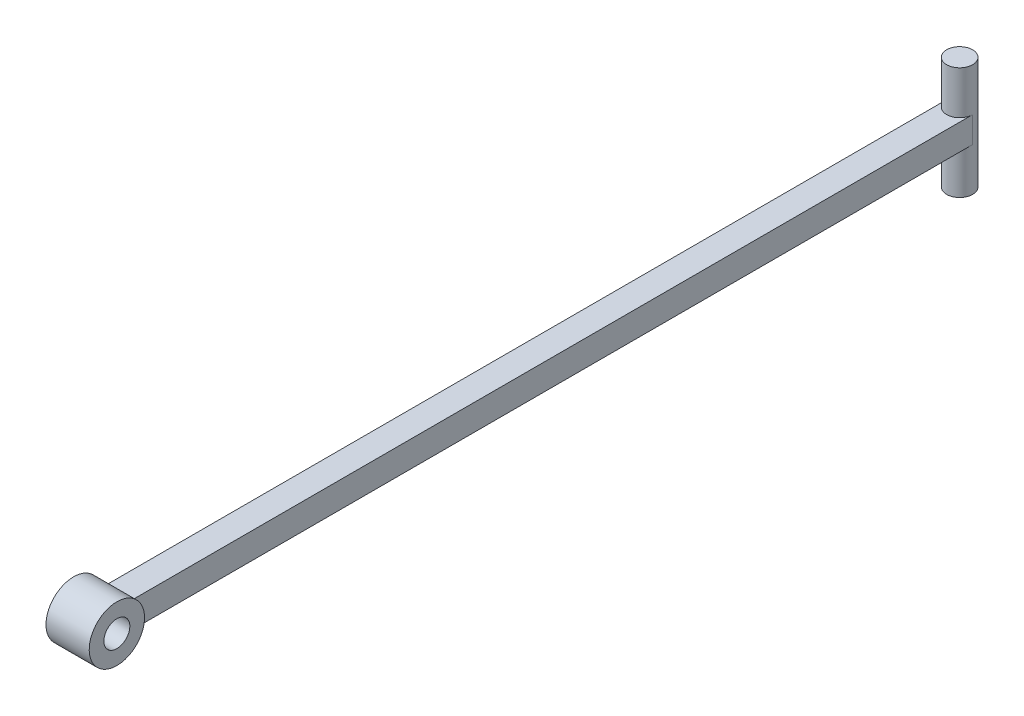
ISO-10303-21;
HEADER;
FILE_DESCRIPTION(('STEP AP214'),'2;1');
FILE_NAME('part.step','',(''),(''),'','','');
FILE_SCHEMA(('AUTOMOTIVE_DESIGN { 1 0 10303 214 1 1 1 1 }'));
ENDSEC;
DATA;
#1=APPLICATION_CONTEXT('core data for automotive mechanical design processes');
#2=APPLICATION_PROTOCOL_DEFINITION('international standard','automotive_design',2000,#1);
#3=PRODUCT_CONTEXT('',#1,'mechanical');
#4=PRODUCT('Part','Part','',(#3));
#5=PRODUCT_RELATED_PRODUCT_CATEGORY('part','',(#4));
#6=PRODUCT_DEFINITION_FORMATION('','',#4);
#7=PRODUCT_DEFINITION_CONTEXT('part definition',#1,'design');
#8=PRODUCT_DEFINITION('design','',#6,#7);
#9=PRODUCT_DEFINITION_SHAPE('','',#8);
#10=(LENGTH_UNIT() NAMED_UNIT(*) SI_UNIT(.MILLI.,.METRE.));
#11=(NAMED_UNIT(*) PLANE_ANGLE_UNIT() SI_UNIT($,.RADIAN.));
#12=(NAMED_UNIT(*) SI_UNIT($,.STERADIAN.) SOLID_ANGLE_UNIT());
#13=UNCERTAINTY_MEASURE_WITH_UNIT(LENGTH_MEASURE(1.E-05),#10,'distance_accuracy_value','');
#14=(GEOMETRIC_REPRESENTATION_CONTEXT(3) GLOBAL_UNCERTAINTY_ASSIGNED_CONTEXT((#13)) GLOBAL_UNIT_ASSIGNED_CONTEXT((#10,
#11,#12)) REPRESENTATION_CONTEXT('',''));
#15=CARTESIAN_POINT('',(0.,0.,0.));
#16=DIRECTION('',(0.,0.,1.));
#17=DIRECTION('',(1.,0.,0.));
#18=AXIS2_PLACEMENT_3D('',#15,#16,#17);
#19=CARTESIAN_POINT('',(0.,0.,2000.));
#20=DIRECTION('',(1.,0.,0.));
#21=DIRECTION('',(0.,1.,0.));
#22=AXIS2_PLACEMENT_3D('',#19,#20,#21);
#23=PLANE('',#22);
#24=DIRECTION('',(0.,0.,-1.));
#25=VECTOR('',#24,1.);
#26=CARTESIAN_POINT('',(0.,-60.,2000.));
#27=LINE('',#26,#25);
#28=CARTESIAN_POINT('',(0.,-60.,1943.46682389959));
#29=VERTEX_POINT('',#28);
#30=CARTESIAN_POINT('',(0.,-60.,0.));
#31=VERTEX_POINT('',#30);
#32=EDGE_CURVE('E47',#29,#31,#27,.T.);
#33=ORIENTED_EDGE('',*,*,#32,.F.);
#34=CARTESIAN_POINT('',(0.,-30.,2000.));
#35=DIRECTION('',(1.,0.,0.));
#36=DIRECTION('',(0.,1.,0.));
#37=AXIS2_PLACEMENT_3D('',#34,#35,#36);
#38=CIRCLE('',#37,64.0000000000001);
#39=CARTESIAN_POINT('',(0.,0.,1943.46682389959));
#40=VERTEX_POINT('',#39);
#41=EDGE_CURVE('E79',#29,#40,#38,.T.);
#42=ORIENTED_EDGE('',*,*,#41,.T.);
#43=DIRECTION('',(0.,0.,-1.));
#44=VECTOR('',#43,1.);
#45=CARTESIAN_POINT('',(0.,0.,2000.));
#46=LINE('',#45,#44);
#47=CARTESIAN_POINT('',(0.,0.,0.));
#48=VERTEX_POINT('',#47);
#49=EDGE_CURVE('E85',#40,#48,#46,.T.);
#50=ORIENTED_EDGE('',*,*,#49,.T.);
#51=DIRECTION('',(0.,-1.,0.));
#52=VECTOR('',#51,1.);
#53=CARTESIAN_POINT('',(0.,0.,0.));
#54=LINE('',#53,#52);
#55=EDGE_CURVE('E104',#48,#31,#54,.T.);
#56=ORIENTED_EDGE('',*,*,#55,.T.);
#57=EDGE_LOOP('',(#33,#42,#50,#56));
#58=FACE_BOUND('',#57,.T.);
#59=ADVANCED_FACE('F39',(#58),#23,.F.);
#60=CARTESIAN_POINT('',(0.,-60.,2000.));
#61=DIRECTION('',(0.,1.,0.));
#62=DIRECTION('',(0.,0.,1.));
#63=AXIS2_PLACEMENT_3D('',#60,#61,#62);
#64=PLANE('',#63);
#65=DIRECTION('',(0.,0.,-1.));
#66=VECTOR('',#65,1.);
#67=CARTESIAN_POINT('',(60.,-60.,2000.));
#68=LINE('',#67,#66);
#69=CARTESIAN_POINT('',(60.,-60.,1943.46682389959));
#70=VERTEX_POINT('',#69);
#71=CARTESIAN_POINT('',(60.,-60.,0.));
#72=VERTEX_POINT('',#71);
#73=EDGE_CURVE('E101',#70,#72,#68,.T.);
#74=ORIENTED_EDGE('',*,*,#73,.F.);
#75=DIRECTION('',(1.,0.,0.));
#76=VECTOR('',#75,1.);
#77=CARTESIAN_POINT('',(-20.,-60.,1943.46682389959));
#78=LINE('',#77,#76);
#79=EDGE_CURVE('E89',#70,#29,#78,.F.);
#80=ORIENTED_EDGE('',*,*,#79,.T.);
#81=ORIENTED_EDGE('',*,*,#32,.T.);
#82=CARTESIAN_POINT('',(30.,-60.,0.));
#83=DIRECTION('',(0.,1.,0.));
#84=DIRECTION('',(0.,0.,1.));
#85=AXIS2_PLACEMENT_3D('',#82,#83,#84);
#86=CIRCLE('',#85,30.);
#87=EDGE_CURVE('E116',#31,#72,#86,.T.);
#88=ORIENTED_EDGE('',*,*,#87,.T.);
#89=EDGE_LOOP('',(#74,#80,#81,#88));
#90=FACE_BOUND('',#89,.T.);
#91=ADVANCED_FACE('F117',(#90),#64,.F.);
#92=CARTESIAN_POINT('',(60.,0.,2000.));
#93=DIRECTION('',(-1.,0.,0.));
#94=DIRECTION('',(0.,-1.,0.));
#95=AXIS2_PLACEMENT_3D('',#92,#93,#94);
#96=PLANE('',#95);
#97=DIRECTION('',(0.,0.,-1.));
#98=VECTOR('',#97,1.);
#99=CARTESIAN_POINT('',(60.,0.,2000.));
#100=LINE('',#99,#98);
#101=CARTESIAN_POINT('',(60.,0.,1943.46682389959));
#102=VERTEX_POINT('',#101);
#103=CARTESIAN_POINT('',(60.,0.,0.));
#104=VERTEX_POINT('',#103);
#105=EDGE_CURVE('E96',#102,#104,#100,.T.);
#106=ORIENTED_EDGE('',*,*,#105,.F.);
#107=CARTESIAN_POINT('',(60.,-30.,2000.));
#108=DIRECTION('',(-1.,0.,0.));
#109=DIRECTION('',(0.,-1.,0.));
#110=AXIS2_PLACEMENT_3D('',#107,#108,#109);
#111=CIRCLE('',#110,64.0000000000001);
#112=EDGE_CURVE('E54',#102,#70,#111,.T.);
#113=ORIENTED_EDGE('',*,*,#112,.T.);
#114=ORIENTED_EDGE('',*,*,#73,.T.);
#115=DIRECTION('',(0.,1.,0.));
#116=VECTOR('',#115,1.);
#117=CARTESIAN_POINT('',(60.,0.,0.));
#118=LINE('',#117,#116);
#119=EDGE_CURVE('E97',#72,#104,#118,.T.);
#120=ORIENTED_EDGE('',*,*,#119,.T.);
#121=EDGE_LOOP('',(#106,#113,#114,#120));
#122=FACE_BOUND('',#121,.T.);
#123=ADVANCED_FACE('F113',(#122),#96,.F.);
#124=CARTESIAN_POINT('',(0.,0.,2000.));
#125=DIRECTION('',(0.,-1.,0.));
#126=DIRECTION('',(0.,0.,-1.));
#127=AXIS2_PLACEMENT_3D('',#124,#125,#126);
#128=PLANE('',#127);
#129=ORIENTED_EDGE('',*,*,#49,.F.);
#130=DIRECTION('',(1.,0.,0.));
#131=VECTOR('',#130,1.);
#132=CARTESIAN_POINT('',(-20.,0.,1943.46682389959));
#133=LINE('',#132,#131);
#134=EDGE_CURVE('E11',#40,#102,#133,.T.);
#135=ORIENTED_EDGE('',*,*,#134,.T.);
#136=ORIENTED_EDGE('',*,*,#105,.T.);
#137=CARTESIAN_POINT('',(30.,0.,0.));
#138=DIRECTION('',(0.,-1.,0.));
#139=DIRECTION('',(0.,0.,-1.));
#140=AXIS2_PLACEMENT_3D('',#137,#138,#139);
#141=CIRCLE('',#140,30.);
#142=EDGE_CURVE('E94',#104,#48,#141,.T.);
#143=ORIENTED_EDGE('',*,*,#142,.T.);
#144=EDGE_LOOP('',(#129,#135,#136,#143));
#145=FACE_BOUND('',#144,.T.);
#146=ADVANCED_FACE('F92',(#145),#128,.F.);
#147=CARTESIAN_POINT('',(30.,-160.,0.));
#148=DIRECTION('',(0.,1.,0.));
#149=DIRECTION('',(0.,0.,1.));
#150=AXIS2_PLACEMENT_3D('',#147,#148,#149);
#151=CYLINDRICAL_SURFACE('',#150,30.);
#152=CARTESIAN_POINT('',(30.,100.,0.));
#153=DIRECTION('',(0.,1.,0.));
#154=DIRECTION('',(0.,0.,1.));
#155=AXIS2_PLACEMENT_3D('',#152,#153,#154);
#156=CIRCLE('',#155,30.);
#157=CARTESIAN_POINT('',(30.,100.,30.));
#158=VERTEX_POINT('',#157);
#159=EDGE_CURVE('E88',#158,#158,#156,.T.);
#160=ORIENTED_EDGE('',*,*,#159,.F.);
#161=EDGE_LOOP('',(#160));
#162=FACE_BOUND('',#161,.T.);
#163=CARTESIAN_POINT('',(30.,-160.,0.));
#164=DIRECTION('',(0.,1.,0.));
#165=DIRECTION('',(0.,0.,1.));
#166=AXIS2_PLACEMENT_3D('',#163,#164,#165);
#167=CIRCLE('',#166,30.);
#168=CARTESIAN_POINT('',(30.,-160.,30.));
#169=VERTEX_POINT('',#168);
#170=EDGE_CURVE('E122',#169,#169,#167,.T.);
#171=ORIENTED_EDGE('',*,*,#170,.T.);
#172=EDGE_LOOP('',(#171));
#173=FACE_BOUND('',#172,.T.);
#174=ORIENTED_EDGE('',*,*,#87,.F.);
#175=ORIENTED_EDGE('',*,*,#55,.F.);
#176=ORIENTED_EDGE('',*,*,#142,.F.);
#177=ORIENTED_EDGE('',*,*,#119,.F.);
#178=EDGE_LOOP('',(#174,#175,#176,#177));
#179=FACE_BOUND('',#178,.T.);
#180=ADVANCED_FACE('F115',(#162,#173,#179),#151,.T.);
#181=CARTESIAN_POINT('',(30.,-160.,0.));
#182=DIRECTION('',(0.,1.,0.));
#183=DIRECTION('',(0.,0.,1.));
#184=AXIS2_PLACEMENT_3D('',#181,#182,#183);
#185=PLANE('',#184);
#186=ORIENTED_EDGE('',*,*,#170,.F.);
#187=EDGE_LOOP('',(#186));
#188=FACE_BOUND('',#187,.T.);
#189=ADVANCED_FACE('F179',(#188),#185,.F.);
#190=CARTESIAN_POINT('',(30.,100.,0.));
#191=DIRECTION('',(0.,1.,0.));
#192=DIRECTION('',(0.,0.,1.));
#193=AXIS2_PLACEMENT_3D('',#190,#191,#192);
#194=PLANE('',#193);
#195=ORIENTED_EDGE('',*,*,#159,.T.);
#196=EDGE_LOOP('',(#195));
#197=FACE_BOUND('',#196,.T.);
#198=ADVANCED_FACE('F183',(#197),#194,.T.);
#199=CARTESIAN_POINT('',(-20.,-30.,2000.));
#200=DIRECTION('',(1.,0.,0.));
#201=DIRECTION('',(0.,1.,0.));
#202=AXIS2_PLACEMENT_3D('',#199,#200,#201);
#203=CYLINDRICAL_SURFACE('',#202,64.0000000000001);
#204=CARTESIAN_POINT('',(80.,-30.,2000.));
#205=DIRECTION('',(1.,0.,0.));
#206=DIRECTION('',(0.,1.,0.));
#207=AXIS2_PLACEMENT_3D('',#204,#205,#206);
#208=CIRCLE('',#207,64.0000000000001);
#209=CARTESIAN_POINT('',(80.,34.0000000000001,2000.));
#210=VERTEX_POINT('',#209);
#211=EDGE_CURVE('E143',#210,#210,#208,.T.);
#212=ORIENTED_EDGE('',*,*,#211,.F.);
#213=EDGE_LOOP('',(#212));
#214=FACE_BOUND('',#213,.T.);
#215=CARTESIAN_POINT('',(-20.,-30.,2000.));
#216=DIRECTION('',(1.,0.,0.));
#217=DIRECTION('',(0.,1.,0.));
#218=AXIS2_PLACEMENT_3D('',#215,#216,#217);
#219=CIRCLE('',#218,64.0000000000001);
#220=CARTESIAN_POINT('',(-20.,34.0000000000001,2000.));
#221=VERTEX_POINT('',#220);
#222=EDGE_CURVE('E135',#221,#221,#219,.T.);
#223=ORIENTED_EDGE('',*,*,#222,.T.);
#224=EDGE_LOOP('',(#223));
#225=FACE_BOUND('',#224,.T.);
#226=ORIENTED_EDGE('',*,*,#41,.F.);
#227=ORIENTED_EDGE('',*,*,#79,.F.);
#228=ORIENTED_EDGE('',*,*,#112,.F.);
#229=ORIENTED_EDGE('',*,*,#134,.F.);
#230=EDGE_LOOP('',(#226,#227,#228,#229));
#231=FACE_BOUND('',#230,.T.);
#232=ADVANCED_FACE('F78',(#214,#225,#231),#203,.T.);
#233=CARTESIAN_POINT('',(-20.,-30.,2000.));
#234=DIRECTION('',(1.,0.,0.));
#235=DIRECTION('',(0.,1.,0.));
#236=AXIS2_PLACEMENT_3D('',#233,#234,#235);
#237=CYLINDRICAL_SURFACE('',#236,30.);
#238=CARTESIAN_POINT('',(-20.,-30.,2000.));
#239=DIRECTION('',(1.,0.,0.));
#240=DIRECTION('',(0.,1.,0.));
#241=AXIS2_PLACEMENT_3D('',#238,#239,#240);
#242=CIRCLE('',#241,30.);
#243=CARTESIAN_POINT('',(-20.,0.,2000.));
#244=VERTEX_POINT('',#243);
#245=EDGE_CURVE('E139',#244,#244,#242,.T.);
#246=ORIENTED_EDGE('',*,*,#245,.F.);
#247=EDGE_LOOP('',(#246));
#248=FACE_BOUND('',#247,.T.);
#249=CARTESIAN_POINT('',(80.,-30.,2000.));
#250=DIRECTION('',(1.,0.,0.));
#251=DIRECTION('',(0.,1.,0.));
#252=AXIS2_PLACEMENT_3D('',#249,#250,#251);
#253=CIRCLE('',#252,30.);
#254=CARTESIAN_POINT('',(80.,0.,2000.));
#255=VERTEX_POINT('',#254);
#256=EDGE_CURVE('E147',#255,#255,#253,.T.);
#257=ORIENTED_EDGE('',*,*,#256,.T.);
#258=EDGE_LOOP('',(#257));
#259=FACE_BOUND('',#258,.T.);
#260=ADVANCED_FACE('F152',(#248,#259),#237,.F.);
#261=CARTESIAN_POINT('',(-20.,-30.,2000.));
#262=DIRECTION('',(1.,0.,0.));
#263=DIRECTION('',(0.,1.,0.));
#264=AXIS2_PLACEMENT_3D('',#261,#262,#263);
#265=PLANE('',#264);
#266=ORIENTED_EDGE('',*,*,#245,.T.);
#267=EDGE_LOOP('',(#266));
#268=FACE_BOUND('',#267,.T.);
#269=ORIENTED_EDGE('',*,*,#222,.F.);
#270=EDGE_LOOP('',(#269));
#271=FACE_BOUND('',#270,.T.);
#272=ADVANCED_FACE('F156',(#268,#271),#265,.F.);
#273=CARTESIAN_POINT('',(80.,-30.,2000.));
#274=DIRECTION('',(1.,0.,0.));
#275=DIRECTION('',(0.,1.,0.));
#276=AXIS2_PLACEMENT_3D('',#273,#274,#275);
#277=PLANE('',#276);
#278=ORIENTED_EDGE('',*,*,#211,.T.);
#279=EDGE_LOOP('',(#278));
#280=FACE_BOUND('',#279,.T.);
#281=ORIENTED_EDGE('',*,*,#256,.F.);
#282=EDGE_LOOP('',(#281));
#283=FACE_BOUND('',#282,.T.);
#284=ADVANCED_FACE('F154',(#280,#283),#277,.T.);
#285=CLOSED_SHELL('',(#59,#91,#123,#146,#180,#189,#198,#232,#260,#272,#284));
#286=MANIFOLD_SOLID_BREP('B2',#285);
#287=ADVANCED_BREP_SHAPE_REPRESENTATION('',(#18,#286),#14);
#288=SHAPE_DEFINITION_REPRESENTATION(#9,#287);
ENDSEC;
END-ISO-10303-21;
